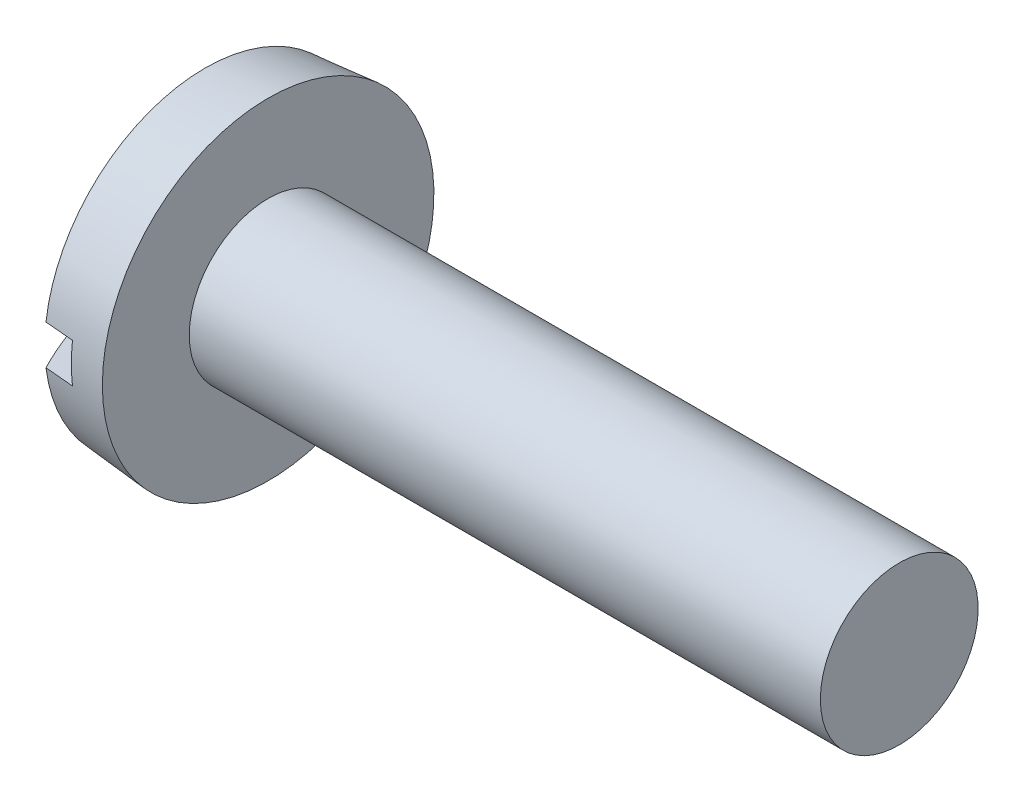
ISO-10303-21;
HEADER;
FILE_DESCRIPTION(('STEP AP214'),'2;1');
FILE_NAME('part.step','',(''),(''),'','','');
FILE_SCHEMA(('AUTOMOTIVE_DESIGN { 1 0 10303 214 1 1 1 1 }'));
ENDSEC;
DATA;
#1=APPLICATION_CONTEXT('core data for automotive mechanical design processes');
#2=APPLICATION_PROTOCOL_DEFINITION('international standard','automotive_design',2000,#1);
#3=PRODUCT_CONTEXT('',#1,'mechanical');
#4=PRODUCT('Part','Part','',(#3));
#5=PRODUCT_RELATED_PRODUCT_CATEGORY('part','',(#4));
#6=PRODUCT_DEFINITION_FORMATION('','',#4);
#7=PRODUCT_DEFINITION_CONTEXT('part definition',#1,'design');
#8=PRODUCT_DEFINITION('design','',#6,#7);
#9=PRODUCT_DEFINITION_SHAPE('','',#8);
#10=(LENGTH_UNIT() NAMED_UNIT(*) SI_UNIT(.MILLI.,.METRE.));
#11=(NAMED_UNIT(*) PLANE_ANGLE_UNIT() SI_UNIT($,.RADIAN.));
#12=(NAMED_UNIT(*) SI_UNIT($,.STERADIAN.) SOLID_ANGLE_UNIT());
#13=UNCERTAINTY_MEASURE_WITH_UNIT(LENGTH_MEASURE(1.E-05),#10,'distance_accuracy_value','');
#14=(GEOMETRIC_REPRESENTATION_CONTEXT(3) GLOBAL_UNCERTAINTY_ASSIGNED_CONTEXT((#13)) GLOBAL_UNIT_ASSIGNED_CONTEXT((#10,
#11,#12)) REPRESENTATION_CONTEXT('',''));
#15=CARTESIAN_POINT('',(0.,0.,0.));
#16=DIRECTION('',(0.,0.,1.));
#17=DIRECTION('',(1.,0.,0.));
#18=AXIS2_PLACEMENT_3D('',#15,#16,#17);
#19=CARTESIAN_POINT('',(4.1402,-1.1938,-10.0076));
#20=DIRECTION('',(1.,0.,0.));
#21=DIRECTION('',(0.,0.,-1.));
#22=AXIS2_PLACEMENT_3D('',#19,#20,#21);
#23=PLANE('',#22);
#24=DIRECTION('',(0.,0.,-1.));
#25=VECTOR('',#24,1.);
#26=CARTESIAN_POINT('',(4.1402,0.735556468531505,-10.0076));
#27=LINE('',#26,#25);
#28=CARTESIAN_POINT('',(4.1402,0.735556468531471,-0.735556468531469));
#29=VERTEX_POINT('',#28);
#30=CARTESIAN_POINT('',(4.1402,0.735556468531479,-2.91484982517482));
#31=VERTEX_POINT('',#30);
#32=EDGE_CURVE('E190',#29,#31,#27,.T.);
#33=ORIENTED_EDGE('',*,*,#32,.F.);
#34=DIRECTION('',(0.,-1.,0.));
#35=VECTOR('',#34,1.);
#36=CARTESIAN_POINT('',(4.1402,-1.1938,-0.735556468531469));
#37=LINE('',#36,#35);
#38=CARTESIAN_POINT('',(4.1402,1.1938,-0.735556468531469));
#39=VERTEX_POINT('',#38);
#40=EDGE_CURVE('E291',#39,#29,#37,.T.);
#41=ORIENTED_EDGE('',*,*,#40,.F.);
#42=DIRECTION('',(0.,0.,1.));
#43=VECTOR('',#42,1.);
#44=CARTESIAN_POINT('',(4.1402,1.1938,-10.0076));
#45=LINE('',#44,#43);
#46=CARTESIAN_POINT('',(4.1402,1.1938,-9.75482339713217));
#47=VERTEX_POINT('',#46);
#48=EDGE_CURVE('E55',#47,#39,#45,.T.);
#49=ORIENTED_EDGE('',*,*,#48,.F.);
#50=CARTESIAN_POINT('',(4.1402,0.,0.));
#51=DIRECTION('',(1.,0.,0.));
#52=DIRECTION('',(0.,0.,-1.));
#53=AXIS2_PLACEMENT_3D('',#50,#51,#52);
#54=CIRCLE('',#53,9.82760082366176);
#55=CARTESIAN_POINT('',(4.1402,-1.1938,-9.75482339713217));
#56=VERTEX_POINT('',#55);
#57=EDGE_CURVE('E244',#56,#47,#54,.T.);
#58=ORIENTED_EDGE('',*,*,#57,.F.);
#59=DIRECTION('',(0.,0.,-1.));
#60=VECTOR('',#59,1.);
#61=CARTESIAN_POINT('',(4.1402,-1.1938,10.0076));
#62=LINE('',#61,#60);
#63=CARTESIAN_POINT('',(4.1402,-1.1938,-0.735556468531469));
#64=VERTEX_POINT('',#63);
#65=EDGE_CURVE('E217',#64,#56,#62,.T.);
#66=ORIENTED_EDGE('',*,*,#65,.F.);
#67=CARTESIAN_POINT('',(4.1402,-0.735556468531466,-0.735556468531469));
#68=VERTEX_POINT('',#67);
#69=EDGE_CURVE('E290',#68,#64,#37,.T.);
#70=ORIENTED_EDGE('',*,*,#69,.F.);
#71=DIRECTION('',(0.,0.,1.));
#72=VECTOR('',#71,1.);
#73=CARTESIAN_POINT('',(4.1402,-0.735556468531434,-10.0076));
#74=LINE('',#73,#72);
#75=CARTESIAN_POINT('',(4.1402,-0.735556468531458,-2.91484982517483));
#76=VERTEX_POINT('',#75);
#77=EDGE_CURVE('E331',#76,#68,#74,.T.);
#78=ORIENTED_EDGE('',*,*,#77,.F.);
#79=DIRECTION('',(0.,1.,0.));
#80=VECTOR('',#79,1.);
#81=CARTESIAN_POINT('',(4.1402,-1.19380000000003,-2.91484982517483));
#82=LINE('',#81,#80);
#83=EDGE_CURVE('E163',#76,#31,#82,.T.);
#84=ORIENTED_EDGE('',*,*,#83,.T.);
#85=EDGE_LOOP('',(#33,#41,#49,#58,#66,#70,#78,#84));
#86=FACE_BOUND('',#85,.T.);
#87=ADVANCED_FACE('F32',(#86),#23,.F.);
#88=DIRECTION('',(0.,0.,-1.));
#89=VECTOR('',#88,1.);
#90=CARTESIAN_POINT('',(4.1402,0.735556468531505,-10.0076));
#91=LINE('',#90,#89);
#92=CARTESIAN_POINT('',(4.1402,0.735556468531458,2.91484982517482));
#93=VERTEX_POINT('',#92);
#94=CARTESIAN_POINT('',(4.1402,0.735556468531466,0.735556468531469));
#95=VERTEX_POINT('',#94);
#96=EDGE_CURVE('E151',#93,#95,#91,.T.);
#97=ORIENTED_EDGE('',*,*,#96,.F.);
#98=DIRECTION('',(0.,-1.,0.));
#99=VECTOR('',#98,1.);
#100=CARTESIAN_POINT('',(4.1402,-1.19380000000005,2.91484982517482));
#101=LINE('',#100,#99);
#102=CARTESIAN_POINT('',(4.1402,-0.735556468531479,2.91484982517482));
#103=VERTEX_POINT('',#102);
#104=EDGE_CURVE('E162',#93,#103,#101,.T.);
#105=ORIENTED_EDGE('',*,*,#104,.T.);
#106=DIRECTION('',(0.,0.,1.));
#107=VECTOR('',#106,1.);
#108=CARTESIAN_POINT('',(4.1402,-0.735556468531434,-10.0076));
#109=LINE('',#108,#107);
#110=CARTESIAN_POINT('',(4.1402,-0.735556468531471,0.735556468531469));
#111=VERTEX_POINT('',#110);
#112=EDGE_CURVE('E339',#111,#103,#109,.T.);
#113=ORIENTED_EDGE('',*,*,#112,.F.);
#114=DIRECTION('',(0.,1.,0.));
#115=VECTOR('',#114,1.);
#116=CARTESIAN_POINT('',(4.1402,-1.1938,0.735556468531469));
#117=LINE('',#116,#115);
#118=CARTESIAN_POINT('',(4.1402,-1.1938,0.735556468531469));
#119=VERTEX_POINT('',#118);
#120=EDGE_CURVE('E288',#119,#111,#117,.T.);
#121=ORIENTED_EDGE('',*,*,#120,.F.);
#122=CARTESIAN_POINT('',(4.1402,-1.1938,9.75482339713217));
#123=VERTEX_POINT('',#122);
#124=EDGE_CURVE('E218',#123,#119,#62,.T.);
#125=ORIENTED_EDGE('',*,*,#124,.F.);
#126=CARTESIAN_POINT('',(4.1402,1.1938,9.75482339713217));
#127=VERTEX_POINT('',#126);
#128=EDGE_CURVE('E248',#127,#123,#54,.T.);
#129=ORIENTED_EDGE('',*,*,#128,.F.);
#130=CARTESIAN_POINT('',(4.1402,1.1938,0.735556468531469));
#131=VERTEX_POINT('',#130);
#132=EDGE_CURVE('E221',#131,#127,#45,.T.);
#133=ORIENTED_EDGE('',*,*,#132,.F.);
#134=EDGE_CURVE('E287',#95,#131,#117,.T.);
#135=ORIENTED_EDGE('',*,*,#134,.F.);
#136=EDGE_LOOP('',(#97,#105,#113,#121,#125,#129,#133,#135));
#137=FACE_BOUND('',#136,.T.);
#138=ADVANCED_FACE('F367',(#137),#23,.F.);
#139=CARTESIAN_POINT('',(7.9338156996587,0.,-0.466952559726962));
#140=DIRECTION('',(-0.0706273813304668,0.,0.997502768420419));
#141=DIRECTION('',(0.99750276842042,0.,0.0706273813304669));
#142=AXIS2_PLACEMENT_3D('',#139,#140,#141);
#143=PLANE('',#142);
#144=ORIENTED_EDGE('',*,*,#40,.T.);
#145=DIRECTION('',(0.995024152382142,-0.0704518849151695,0.0704518849151692));
#146=VECTOR('',#145,1.);
#147=CARTESIAN_POINT('',(7.96654969377497,0.464634855598103,-0.464634855598101));
#148=LINE('',#147,#146);
#149=CARTESIAN_POINT('',(7.2644,0.514350000000002,-0.514349999999998));
#150=VERTEX_POINT('',#149);
#151=EDGE_CURVE('E192',#29,#150,#148,.T.);
#152=ORIENTED_EDGE('',*,*,#151,.T.);
#153=DIRECTION('',(0.791711995704343,-0.608317171524578,0.0560565311643809));
#154=VECTOR('',#153,1.);
#155=CARTESIAN_POINT('',(0.,6.096,-1.0287));
#156=LINE('',#155,#154);
#157=CARTESIAN_POINT('',(0.766265218274357,5.50723502896577,-0.974445207447358));
#158=VERTEX_POINT('',#157);
#159=EDGE_CURVE('E174',#158,#150,#156,.T.);
#160=ORIENTED_EDGE('',*,*,#159,.F.);
#161=CARTESIAN_POINT('',(20.7620372182505,0.,0.44133934849501));
#162=DIRECTION('',(-0.0706273813304668,0.,0.997502768420419));
#163=DIRECTION('',(0.99750276842042,0.,0.0706273813304669));
#164=AXIS2_PLACEMENT_3D('',#161,#162,#163);
#165=CIRCLE('',#164,20.788578148785);
#166=CARTESIAN_POINT('',(0.0595930389803816,1.1938,-1.02448056279947));
#167=VERTEX_POINT('',#166);
#168=EDGE_CURVE('E211',#167,#158,#165,.F.);
#169=ORIENTED_EDGE('',*,*,#168,.F.);
#170=DIRECTION('',(-0.99750276842042,0.,-0.0706273813304669));
#171=VECTOR('',#170,1.);
#172=CARTESIAN_POINT('',(3.48697518324759,1.1938,-0.781807526360966));
#173=LINE('',#172,#171);
#174=EDGE_CURVE('E205',#39,#167,#173,.T.);
#175=ORIENTED_EDGE('',*,*,#174,.F.);
#176=EDGE_LOOP('',(#144,#152,#160,#169,#175));
#177=FACE_BOUND('',#176,.T.);
#178=ADVANCED_FACE('F357',(#177),#143,.T.);
#179=DIRECTION('',(0.791711995704343,0.608317171524578,0.0560565311643811));
#180=VECTOR('',#179,1.);
#181=CARTESIAN_POINT('',(0.,-6.096,-1.0287));
#182=LINE('',#181,#180);
#183=CARTESIAN_POINT('',(0.76626521827435,-5.50723502896577,-0.974445207447359));
#184=VERTEX_POINT('',#183);
#185=CARTESIAN_POINT('',(7.2644,-0.51435,-0.51435));
#186=VERTEX_POINT('',#185);
#187=EDGE_CURVE('E175',#184,#186,#182,.T.);
#188=ORIENTED_EDGE('',*,*,#187,.T.);
#189=DIRECTION('',(-0.995024152382142,-0.0704518849151689,-0.0704518849151692));
#190=VECTOR('',#189,1.);
#191=CARTESIAN_POINT('',(7.96654969377497,-0.464634855598099,-0.464634855598101));
#192=LINE('',#191,#190);
#193=EDGE_CURVE('E336',#186,#68,#192,.T.);
#194=ORIENTED_EDGE('',*,*,#193,.T.);
#195=ORIENTED_EDGE('',*,*,#69,.T.);
#196=DIRECTION('',(0.99750276842042,0.,0.0706273813304669));
#197=VECTOR('',#196,1.);
#198=CARTESIAN_POINT('',(4.89706620664382,-1.1938,-0.68196716543868));
#199=LINE('',#198,#197);
#200=CARTESIAN_POINT('',(0.0595930389803816,-1.1938,-1.02448056279947));
#201=VERTEX_POINT('',#200);
#202=EDGE_CURVE('E208',#201,#64,#199,.T.);
#203=ORIENTED_EDGE('',*,*,#202,.F.);
#204=CARTESIAN_POINT('',(20.7620372182505,0.,0.44133934849501));
#205=DIRECTION('',(-0.0706273813304668,0.,0.997502768420419));
#206=DIRECTION('',(0.99750276842042,0.,0.0706273813304669));
#207=AXIS2_PLACEMENT_3D('',#204,#205,#206);
#208=CIRCLE('',#207,20.788578148785);
#209=EDGE_CURVE('E214',#184,#201,#208,.F.);
#210=ORIENTED_EDGE('',*,*,#209,.F.);
#211=EDGE_LOOP('',(#188,#194,#195,#203,#210));
#212=FACE_BOUND('',#211,.T.);
#213=ADVANCED_FACE('F334',(#212),#143,.T.);
#214=CARTESIAN_POINT('',(7.9338156996587,0.,0.466952559726962));
#215=DIRECTION('',(-0.0706273813304668,0.,-0.997502768420419));
#216=DIRECTION('',(-0.99750276842042,0.,0.0706273813304668));
#217=AXIS2_PLACEMENT_3D('',#214,#215,#216);
#218=PLANE('',#217);
#219=DIRECTION('',(0.791711995704343,-0.608317171524578,-0.0560565311643809));
#220=VECTOR('',#219,1.);
#221=CARTESIAN_POINT('',(0.,6.096,1.0287));
#222=LINE('',#221,#220);
#223=CARTESIAN_POINT('',(0.766265218274357,5.50723502896577,0.974445207447358));
#224=VERTEX_POINT('',#223);
#225=CARTESIAN_POINT('',(7.2644,0.514349999999998,0.514350000000002));
#226=VERTEX_POINT('',#225);
#227=EDGE_CURVE('E167',#224,#226,#222,.T.);
#228=ORIENTED_EDGE('',*,*,#227,.T.);
#229=DIRECTION('',(-0.995024152382142,0.070451884915169,0.0704518849151691));
#230=VECTOR('',#229,1.);
#231=CARTESIAN_POINT('',(7.96654969377497,0.464634855598099,0.464634855598101));
#232=LINE('',#231,#230);
#233=EDGE_CURVE('E11',#226,#95,#232,.T.);
#234=ORIENTED_EDGE('',*,*,#233,.T.);
#235=ORIENTED_EDGE('',*,*,#134,.T.);
#236=DIRECTION('',(0.99750276842042,0.,-0.0706273813304668));
#237=VECTOR('',#236,1.);
#238=CARTESIAN_POINT('',(4.89706620664382,1.1938,0.68196716543868));
#239=LINE('',#238,#237);
#240=CARTESIAN_POINT('',(0.0595930389803816,1.1938,1.02448056279947));
#241=VERTEX_POINT('',#240);
#242=EDGE_CURVE('E197',#241,#131,#239,.T.);
#243=ORIENTED_EDGE('',*,*,#242,.F.);
#244=CARTESIAN_POINT('',(20.7620372182505,0.,-0.441339348495009));
#245=DIRECTION('',(-0.0706273813304668,0.,-0.997502768420419));
#246=DIRECTION('',(-0.99750276842042,0.,0.0706273813304668));
#247=AXIS2_PLACEMENT_3D('',#244,#245,#246);
#248=CIRCLE('',#247,20.788578148785);
#249=EDGE_CURVE('E171',#224,#241,#248,.F.);
#250=ORIENTED_EDGE('',*,*,#249,.F.);
#251=EDGE_LOOP('',(#228,#234,#235,#243,#250));
#252=FACE_BOUND('',#251,.T.);
#253=ADVANCED_FACE('F169',(#252),#218,.T.);
#254=ORIENTED_EDGE('',*,*,#120,.T.);
#255=DIRECTION('',(0.995024152382142,0.0704518849151694,-0.0704518849151691));
#256=VECTOR('',#255,1.);
#257=CARTESIAN_POINT('',(7.96654969377497,-0.464634855598102,0.464634855598101));
#258=LINE('',#257,#256);
#259=CARTESIAN_POINT('',(7.2644,-0.51435,0.51435));
#260=VERTEX_POINT('',#259);
#261=EDGE_CURVE('E306',#111,#260,#258,.T.);
#262=ORIENTED_EDGE('',*,*,#261,.T.);
#263=DIRECTION('',(0.791711995704343,0.608317171524578,-0.0560565311643809));
#264=VECTOR('',#263,1.);
#265=CARTESIAN_POINT('',(0.,-6.096,1.0287));
#266=LINE('',#265,#264);
#267=CARTESIAN_POINT('',(0.76626521827435,-5.50723502896577,0.974445207447358));
#268=VERTEX_POINT('',#267);
#269=EDGE_CURVE('E301',#268,#260,#266,.T.);
#270=ORIENTED_EDGE('',*,*,#269,.F.);
#271=CARTESIAN_POINT('',(20.7620372182505,0.,-0.441339348495009));
#272=DIRECTION('',(-0.0706273813304668,0.,-0.997502768420419));
#273=DIRECTION('',(-0.99750276842042,0.,0.0706273813304668));
#274=AXIS2_PLACEMENT_3D('',#271,#272,#273);
#275=CIRCLE('',#274,20.788578148785);
#276=CARTESIAN_POINT('',(0.0595930389803816,-1.1938,1.02448056279947));
#277=VERTEX_POINT('',#276);
#278=EDGE_CURVE('E202',#277,#268,#275,.F.);
#279=ORIENTED_EDGE('',*,*,#278,.F.);
#280=DIRECTION('',(-0.99750276842042,0.,0.0706273813304668));
#281=VECTOR('',#280,1.);
#282=CARTESIAN_POINT('',(3.48697518324759,-1.1938,0.781807526360966));
#283=LINE('',#282,#281);
#284=EDGE_CURVE('E47',#119,#277,#283,.T.);
#285=ORIENTED_EDGE('',*,*,#284,.F.);
#286=EDGE_LOOP('',(#254,#262,#270,#279,#285));
#287=FACE_BOUND('',#286,.T.);
#288=ADVANCED_FACE('F305',(#287),#218,.T.);
#289=CARTESIAN_POINT('',(20.7932858958974,0.,0.));
#290=DIRECTION('',(-1.,0.,0.));
#291=DIRECTION('',(0.,1.,0.));
#292=AXIS2_PLACEMENT_3D('',#289,#290,#291);
#293=SPHERICAL_SURFACE('',#292,20.7932858958974);
#294=CARTESIAN_POINT('',(16.0196413750384,6.21279787470168,0.));
#295=DIRECTION('',(0.609275198020805,-0.79295884702594,0.));
#296=DIRECTION('',(0.79295884702594,0.609275198020805,0.));
#297=AXIS2_PLACEMENT_3D('',#294,#295,#296);
#298=CIRCLE('',#297,19.2606905095612);
#299=EDGE_CURVE('E40',#184,#268,#298,.F.);
#300=ORIENTED_EDGE('',*,*,#299,.F.);
#301=ORIENTED_EDGE('',*,*,#209,.T.);
#302=CARTESIAN_POINT('',(20.7932858958974,-1.1938,0.));
#303=DIRECTION('',(0.,1.,0.));
#304=DIRECTION('',(0.,0.,1.));
#305=AXIS2_PLACEMENT_3D('',#302,#303,#304);
#306=CIRCLE('',#305,20.758987930738);
#307=CARTESIAN_POINT('',(2.3876,-1.1938,-9.6003284636563));
#308=VERTEX_POINT('',#307);
#309=EDGE_CURVE('E227',#201,#308,#306,.F.);
#310=ORIENTED_EDGE('',*,*,#309,.T.);
#311=CARTESIAN_POINT('',(2.3876,0.,0.));
#312=DIRECTION('',(-1.,0.,0.));
#313=DIRECTION('',(0.,0.,1.));
#314=AXIS2_PLACEMENT_3D('',#311,#312,#313);
#315=CIRCLE('',#314,9.67426819196622);
#316=CARTESIAN_POINT('',(2.3876,-1.1938,9.60032846365631));
#317=VERTEX_POINT('',#316);
#318=EDGE_CURVE('E237',#308,#317,#315,.T.);
#319=ORIENTED_EDGE('',*,*,#318,.T.);
#320=EDGE_CURVE('E228',#317,#277,#306,.F.);
#321=ORIENTED_EDGE('',*,*,#320,.T.);
#322=ORIENTED_EDGE('',*,*,#278,.T.);
#323=EDGE_LOOP('',(#300,#301,#310,#319,#321,#322));
#324=FACE_BOUND('',#323,.T.);
#325=ADVANCED_FACE('F308',(#324),#293,.T.);
#326=CARTESIAN_POINT('',(20.7932858958974,1.1938,0.));
#327=DIRECTION('',(0.,-1.,0.));
#328=DIRECTION('',(0.,0.,-1.));
#329=AXIS2_PLACEMENT_3D('',#326,#327,#328);
#330=CIRCLE('',#329,20.758987930738);
#331=CARTESIAN_POINT('',(2.3876,1.1938,-9.6003284636563));
#332=VERTEX_POINT('',#331);
#333=EDGE_CURVE('E224',#332,#167,#330,.F.);
#334=ORIENTED_EDGE('',*,*,#333,.T.);
#335=ORIENTED_EDGE('',*,*,#168,.T.);
#336=CARTESIAN_POINT('',(16.0196413750384,-6.21279787470168,0.));
#337=DIRECTION('',(0.609275198020805,0.79295884702594,0.));
#338=DIRECTION('',(-0.79295884702594,0.609275198020805,0.));
#339=AXIS2_PLACEMENT_3D('',#336,#337,#338);
#340=CIRCLE('',#339,19.2606905095612);
#341=EDGE_CURVE('E294',#224,#158,#340,.F.);
#342=ORIENTED_EDGE('',*,*,#341,.F.);
#343=ORIENTED_EDGE('',*,*,#249,.T.);
#344=CARTESIAN_POINT('',(2.3876,1.1938,9.60032846365631));
#345=VERTEX_POINT('',#344);
#346=EDGE_CURVE('E223',#241,#345,#330,.F.);
#347=ORIENTED_EDGE('',*,*,#346,.T.);
#348=EDGE_CURVE('E238',#345,#332,#315,.T.);
#349=ORIENTED_EDGE('',*,*,#348,.T.);
#350=EDGE_LOOP('',(#334,#335,#342,#343,#347,#349));
#351=FACE_BOUND('',#350,.T.);
#352=ADVANCED_FACE('F371',(#351),#293,.T.);
#353=CARTESIAN_POINT('',(4.1402,-1.1938,10.0076));
#354=DIRECTION('',(0.,1.,0.));
#355=DIRECTION('',(0.,0.,1.));
#356=AXIS2_PLACEMENT_3D('',#353,#354,#355);
#357=PLANE('',#356);
#358=ORIENTED_EDGE('',*,*,#309,.F.);
#359=ORIENTED_EDGE('',*,*,#202,.T.);
#360=ORIENTED_EDGE('',*,*,#65,.T.);
#361=CARTESIAN_POINT('',(20.9117012509634,-1.1938,-11.2316513836527));
#362=CARTESIAN_POINT('',(17.938567985907,-1.1938,-10.9700682003354));
#363=CARTESIAN_POINT('',(14.9654431862068,-1.1938,-10.7083887516575));
#364=CARTESIAN_POINT('',(9.01921592215575,-1.1938,-10.184776634628));
#365=CARTESIAN_POINT('',(6.04611345780453,-1.1938,-9.92284396627949));
#366=CARTESIAN_POINT('',(0.0999361805824389,-1.1938,-9.3986647131698));
#367=CARTESIAN_POINT('',(-2.87313863228829,-1.1938,-9.1364181284069));
#368=CARTESIAN_POINT('',(-8.81925174397984,-1.1938,-8.61151093989115));
#369=CARTESIAN_POINT('',(-11.7922900428002,-1.1938,-8.34885033613322));
#370=CARTESIAN_POINT('',(-14.7653056248362,-1.1938,-8.08593267410108));
#371=B_SPLINE_CURVE_WITH_KNOTS('',3,(#361,#362,#363,#364,#365,#366,#367,#368,#369,#370),
.UNSPECIFIED.,.F.,.F.,(4,2,2,2,4),(0.,8.95385529477066,17.9077104804771,26.8615657145967,
35.815421058678),.UNSPECIFIED.);
#372=EDGE_CURVE('E255',#56,#308,#371,.T.);
#373=ORIENTED_EDGE('',*,*,#372,.T.);
#374=EDGE_LOOP('',(#358,#359,#360,#373));
#375=FACE_BOUND('',#374,.T.);
#376=ADVANCED_FACE('F273',(#375),#357,.T.);
#377=ORIENTED_EDGE('',*,*,#124,.T.);
#378=ORIENTED_EDGE('',*,*,#284,.T.);
#379=ORIENTED_EDGE('',*,*,#320,.F.);
#380=CARTESIAN_POINT('',(-14.7653056248362,-1.1938,8.08593267410108));
#381=CARTESIAN_POINT('',(-9.7725766602337,-1.1938,8.52744442815466));
#382=CARTESIAN_POINT('',(-4.77978655062093,-1.1938,8.96826372913463));
#383=CARTESIAN_POINT('',(1.16637171857507,-1.1938,9.49265901068568));
#384=CARTESIAN_POINT('',(2.11969753162393,-1.1938,9.57671508223217));
#385=CARTESIAN_POINT('',(9.01920230702145,-1.1938,10.184931448165));
#386=CARTESIAN_POINT('',(14.9654374639212,-1.1938,10.7084544533859));
#387=CARTESIAN_POINT('',(20.9117012509634,-1.1938,11.2316513836527));
#388=B_SPLINE_CURVE_WITH_KNOTS('',3,(#380,#381,#382,#383,#384,#385,#386,#387),.UNSPECIFIED.,.F.,
.F.,(4,2,2,4),(0.,15.036637627572,17.9077105555857,35.8154210198248),.UNSPECIFIED.);
#389=EDGE_CURVE('E282',#317,#123,#388,.T.);
#390=ORIENTED_EDGE('',*,*,#389,.T.);
#391=EDGE_LOOP('',(#377,#378,#379,#390));
#392=FACE_BOUND('',#391,.T.);
#393=ADVANCED_FACE('F270',(#392),#357,.T.);
#394=CARTESIAN_POINT('',(4.1402,1.1938,-10.0076));
#395=DIRECTION('',(0.,-1.,0.));
#396=DIRECTION('',(0.,0.,-1.));
#397=AXIS2_PLACEMENT_3D('',#394,#395,#396);
#398=PLANE('',#397);
#399=ORIENTED_EDGE('',*,*,#48,.T.);
#400=ORIENTED_EDGE('',*,*,#174,.T.);
#401=ORIENTED_EDGE('',*,*,#333,.F.);
#402=CARTESIAN_POINT('',(-14.7653056248362,1.1938,-8.08593267410108));
#403=CARTESIAN_POINT('',(-9.77257666023366,1.1938,-8.52744442815466));
#404=CARTESIAN_POINT('',(-4.77978655062092,1.1938,-8.96826372913463));
#405=CARTESIAN_POINT('',(1.16637171857507,1.1938,-9.49265901068568));
#406=CARTESIAN_POINT('',(2.11969753162393,1.1938,-9.57671508223217));
#407=CARTESIAN_POINT('',(9.01920230702146,1.1938,-10.184931448165));
#408=CARTESIAN_POINT('',(14.9654374639212,1.1938,-10.7084544533859));
#409=CARTESIAN_POINT('',(20.9117012509634,1.1938,-11.2316513836527));
#410=B_SPLINE_CURVE_WITH_KNOTS('',3,(#402,#403,#404,#405,#406,#407,#408,#409),.UNSPECIFIED.,.F.,
.F.,(4,2,2,4),(0.,15.036637627572,17.9077105555857,35.8154210198248),.UNSPECIFIED.);
#411=EDGE_CURVE('E247',#332,#47,#410,.T.);
#412=ORIENTED_EDGE('',*,*,#411,.T.);
#413=EDGE_LOOP('',(#399,#400,#401,#412));
#414=FACE_BOUND('',#413,.T.);
#415=ADVANCED_FACE('F265',(#414),#398,.T.);
#416=ORIENTED_EDGE('',*,*,#346,.F.);
#417=ORIENTED_EDGE('',*,*,#242,.T.);
#418=ORIENTED_EDGE('',*,*,#132,.T.);
#419=CARTESIAN_POINT('',(20.9117012509634,1.1938,11.2316513836527));
#420=CARTESIAN_POINT('',(17.938567985907,1.1938,10.9700682003354));
#421=CARTESIAN_POINT('',(14.9654431862068,1.1938,10.7083887516575));
#422=CARTESIAN_POINT('',(9.01921592215575,1.1938,10.184776634628));
#423=CARTESIAN_POINT('',(6.04611345780453,1.1938,9.92284396627949));
#424=CARTESIAN_POINT('',(0.0999361805824389,1.1938,9.3986647131698));
#425=CARTESIAN_POINT('',(-2.87313863228829,1.1938,9.1364181284069));
#426=CARTESIAN_POINT('',(-8.81925174397984,1.1938,8.61151093989115));
#427=CARTESIAN_POINT('',(-11.7922900428002,1.1938,8.34885033613322));
#428=CARTESIAN_POINT('',(-14.7653056248362,1.1938,8.08593267410108));
#429=B_SPLINE_CURVE_WITH_KNOTS('',3,(#419,#420,#421,#422,#423,#424,#425,#426,#427,#428),
.UNSPECIFIED.,.F.,.F.,(4,2,2,2,4),(0.,8.95385529477066,17.9077104804771,26.8615657145967,
35.815421058678),.UNSPECIFIED.);
#430=EDGE_CURVE('E276',#127,#345,#429,.T.);
#431=ORIENTED_EDGE('',*,*,#430,.T.);
#432=EDGE_LOOP('',(#416,#417,#418,#431));
#433=FACE_BOUND('',#432,.T.);
#434=ADVANCED_FACE('F269',(#433),#398,.T.);
#435=CARTESIAN_POINT('',(6.1976,0.,0.));
#436=DIRECTION('',(1.,0.,0.));
#437=DIRECTION('',(0.,0.,-1.));
#438=AXIS2_PLACEMENT_3D('',#435,#436,#437);
#439=CONICAL_SURFACE('',#438,10.0076,0.0872664625997194);
#440=CARTESIAN_POINT('',(6.1976,0.,0.));
#441=DIRECTION('',(-1.,0.,0.));
#442=DIRECTION('',(0.,0.,1.));
#443=AXIS2_PLACEMENT_3D('',#440,#441,#442);
#444=CIRCLE('',#443,10.0076);
#445=CARTESIAN_POINT('',(6.1976,0.,10.0076));
#446=VERTEX_POINT('',#445);
#447=EDGE_CURVE('E234',#446,#446,#444,.T.);
#448=ORIENTED_EDGE('',*,*,#447,.T.);
#449=EDGE_LOOP('',(#448));
#450=FACE_BOUND('',#449,.T.);
#451=ORIENTED_EDGE('',*,*,#389,.F.);
#452=ORIENTED_EDGE('',*,*,#318,.F.);
#453=ORIENTED_EDGE('',*,*,#372,.F.);
#454=ORIENTED_EDGE('',*,*,#57,.T.);
#455=ORIENTED_EDGE('',*,*,#411,.F.);
#456=ORIENTED_EDGE('',*,*,#348,.F.);
#457=ORIENTED_EDGE('',*,*,#430,.F.);
#458=ORIENTED_EDGE('',*,*,#128,.T.);
#459=EDGE_LOOP('',(#451,#452,#453,#454,#455,#456,#457,#458));
#460=FACE_BOUND('',#459,.T.);
#461=ADVANCED_FACE('F261',(#450,#460),#439,.T.);
#462=CARTESIAN_POINT('',(-25.4,0.,0.));
#463=DIRECTION('',(-1.,0.,0.));
#464=DIRECTION('',(0.,0.,1.));
#465=AXIS2_PLACEMENT_3D('',#462,#463,#464);
#466=CYLINDRICAL_SURFACE('',#465,4.7625);
#467=CARTESIAN_POINT('',(44.2976,0.,0.));
#468=DIRECTION('',(-1.,0.,0.));
#469=DIRECTION('',(0.,0.,1.));
#470=AXIS2_PLACEMENT_3D('',#467,#468,#469);
#471=CIRCLE('',#470,4.7625);
#472=CARTESIAN_POINT('',(44.2976,0.,4.7625));
#473=VERTEX_POINT('',#472);
#474=EDGE_CURVE('E241',#473,#473,#471,.T.);
#475=ORIENTED_EDGE('',*,*,#474,.T.);
#476=EDGE_LOOP('',(#475));
#477=FACE_BOUND('',#476,.T.);
#478=CARTESIAN_POINT('',(6.1976,0.,0.));
#479=DIRECTION('',(-1.,0.,0.));
#480=DIRECTION('',(0.,0.,1.));
#481=AXIS2_PLACEMENT_3D('',#478,#479,#480);
#482=CIRCLE('',#481,4.7625);
#483=CARTESIAN_POINT('',(6.1976,0.,4.7625));
#484=VERTEX_POINT('',#483);
#485=EDGE_CURVE('E231',#484,#484,#482,.T.);
#486=ORIENTED_EDGE('',*,*,#485,.F.);
#487=EDGE_LOOP('',(#486));
#488=FACE_BOUND('',#487,.T.);
#489=ADVANCED_FACE('F34',(#477,#488),#466,.T.);
#490=CARTESIAN_POINT('',(44.2976,4.7625,0.));
#491=DIRECTION('',(1.,0.,0.));
#492=DIRECTION('',(0.,0.,-1.));
#493=AXIS2_PLACEMENT_3D('',#490,#491,#492);
#494=PLANE('',#493);
#495=ORIENTED_EDGE('',*,*,#474,.F.);
#496=EDGE_LOOP('',(#495));
#497=FACE_BOUND('',#496,.T.);
#498=ADVANCED_FACE('F400',(#497),#494,.T.);
#499=CARTESIAN_POINT('',(6.1976,4.7625,0.));
#500=DIRECTION('',(-1.,0.,0.));
#501=DIRECTION('',(0.,0.,1.));
#502=AXIS2_PLACEMENT_3D('',#499,#500,#501);
#503=PLANE('',#502);
#504=ORIENTED_EDGE('',*,*,#447,.F.);
#505=EDGE_LOOP('',(#504));
#506=FACE_BOUND('',#505,.T.);
#507=ORIENTED_EDGE('',*,*,#485,.T.);
#508=EDGE_LOOP('',(#507));
#509=FACE_BOUND('',#508,.T.);
#510=ADVANCED_FACE('F395',(#506,#509),#503,.F.);
#511=CARTESIAN_POINT('',(7.2644,0.51435,0.51435));
#512=DIRECTION('',(-1.,0.,0.));
#513=DIRECTION('',(0.,0.,1.));
#514=AXIS2_PLACEMENT_3D('',#511,#512,#513);
#515=PLANE('',#514);
#516=DIRECTION('',(0.,1.,0.));
#517=VECTOR('',#516,1.);
#518=CARTESIAN_POINT('',(7.2644,-0.51435,0.51435));
#519=LINE('',#518,#517);
#520=EDGE_CURVE('E159',#260,#226,#519,.T.);
#521=ORIENTED_EDGE('',*,*,#520,.T.);
#522=DIRECTION('',(0.,0.,-1.));
#523=VECTOR('',#522,1.);
#524=CARTESIAN_POINT('',(7.2644,0.51435,0.51435));
#525=LINE('',#524,#523);
#526=EDGE_CURVE('E179',#226,#150,#525,.T.);
#527=ORIENTED_EDGE('',*,*,#526,.T.);
#528=DIRECTION('',(0.,-1.,0.));
#529=VECTOR('',#528,1.);
#530=CARTESIAN_POINT('',(7.2644,0.51435,-0.51435));
#531=LINE('',#530,#529);
#532=EDGE_CURVE('E184',#150,#186,#531,.T.);
#533=ORIENTED_EDGE('',*,*,#532,.T.);
#534=DIRECTION('',(0.,0.,1.));
#535=VECTOR('',#534,1.);
#536=CARTESIAN_POINT('',(7.2644,-0.51435,-0.51435));
#537=LINE('',#536,#535);
#538=EDGE_CURVE('E189',#186,#260,#537,.T.);
#539=ORIENTED_EDGE('',*,*,#538,.T.);
#540=EDGE_LOOP('',(#521,#527,#533,#539));
#541=FACE_BOUND('',#540,.T.);
#542=ADVANCED_FACE('F187',(#541),#515,.T.);
#543=CARTESIAN_POINT('',(7.2644,0.51435,0.51435));
#544=DIRECTION('',(0.609275198020805,0.79295884702594,0.));
#545=DIRECTION('',(-0.79295884702594,0.609275198020805,0.));
#546=AXIS2_PLACEMENT_3D('',#543,#544,#545);
#547=PLANE('',#546);
#548=ORIENTED_EDGE('',*,*,#341,.T.);
#549=ORIENTED_EDGE('',*,*,#159,.T.);
#550=ORIENTED_EDGE('',*,*,#526,.F.);
#551=ORIENTED_EDGE('',*,*,#227,.F.);
#552=EDGE_LOOP('',(#548,#549,#550,#551));
#553=FACE_BOUND('',#552,.T.);
#554=ADVANCED_FACE('F180',(#553),#547,.F.);
#555=CARTESIAN_POINT('',(7.2644,-0.51435,-0.51435));
#556=DIRECTION('',(0.609275198020805,-0.79295884702594,0.));
#557=DIRECTION('',(0.79295884702594,0.609275198020805,0.));
#558=AXIS2_PLACEMENT_3D('',#555,#556,#557);
#559=PLANE('',#558);
#560=ORIENTED_EDGE('',*,*,#299,.T.);
#561=ORIENTED_EDGE('',*,*,#269,.T.);
#562=ORIENTED_EDGE('',*,*,#538,.F.);
#563=ORIENTED_EDGE('',*,*,#187,.F.);
#564=EDGE_LOOP('',(#560,#561,#562,#563));
#565=FACE_BOUND('',#564,.T.);
#566=ADVANCED_FACE('F300',(#565),#559,.F.);
#567=CARTESIAN_POINT('',(7.9338156996587,-0.466952559726962,0.));
#568=DIRECTION('',(-0.0706273813304668,0.997502768420419,0.));
#569=DIRECTION('',(-0.99750276842042,-0.0706273813304668,0.));
#570=AXIS2_PLACEMENT_3D('',#567,#568,#569);
#571=PLANE('',#570);
#572=ORIENTED_EDGE('',*,*,#112,.T.);
#573=DIRECTION('',(0.791711995704343,0.0560565311643831,-0.608317171524578));
#574=VECTOR('',#573,1.);
#575=CARTESIAN_POINT('',(0.,-1.02870000000002,6.096));
#576=LINE('',#575,#574);
#577=EDGE_CURVE('E164',#103,#260,#576,.T.);
#578=ORIENTED_EDGE('',*,*,#577,.T.);
#579=ORIENTED_EDGE('',*,*,#261,.F.);
#580=EDGE_LOOP('',(#572,#578,#579));
#581=FACE_BOUND('',#580,.T.);
#582=ADVANCED_FACE('F365',(#581),#571,.T.);
#583=CARTESIAN_POINT('',(7.9338156996587,0.466952559726962,0.));
#584=DIRECTION('',(-0.0706273813304668,-0.997502768420419,0.));
#585=DIRECTION('',(0.99750276842042,-0.0706273813304669,0.));
#586=AXIS2_PLACEMENT_3D('',#583,#584,#585);
#587=PLANE('',#586);
#588=ORIENTED_EDGE('',*,*,#96,.T.);
#589=ORIENTED_EDGE('',*,*,#233,.F.);
#590=DIRECTION('',(0.791711995704343,-0.0560565311643788,-0.608317171524579));
#591=VECTOR('',#590,1.);
#592=CARTESIAN_POINT('',(0.,1.02869999999998,6.096));
#593=LINE('',#592,#591);
#594=EDGE_CURVE('E149',#93,#226,#593,.T.);
#595=ORIENTED_EDGE('',*,*,#594,.F.);
#596=EDGE_LOOP('',(#588,#589,#595));
#597=FACE_BOUND('',#596,.T.);
#598=ADVANCED_FACE('F148',(#597),#587,.T.);
#599=CARTESIAN_POINT('',(7.2644,-0.514350000000002,0.514349999999998));
#600=DIRECTION('',(0.609275198020805,0.,0.79295884702594));
#601=DIRECTION('',(-0.79295884702594,0.,0.609275198020805));
#602=AXIS2_PLACEMENT_3D('',#599,#600,#601);
#603=PLANE('',#602);
#604=ORIENTED_EDGE('',*,*,#594,.T.);
#605=ORIENTED_EDGE('',*,*,#520,.F.);
#606=ORIENTED_EDGE('',*,*,#577,.F.);
#607=ORIENTED_EDGE('',*,*,#104,.F.);
#608=EDGE_LOOP('',(#604,#605,#606,#607));
#609=FACE_BOUND('',#608,.T.);
#610=ADVANCED_FACE('F156',(#609),#603,.F.);
#611=ORIENTED_EDGE('',*,*,#32,.T.);
#612=DIRECTION('',(0.791711995704343,-0.0560565311643832,0.608317171524578));
#613=VECTOR('',#612,1.);
#614=CARTESIAN_POINT('',(0.,1.02870000000002,-6.096));
#615=LINE('',#614,#613);
#616=EDGE_CURVE('E354',#31,#150,#615,.T.);
#617=ORIENTED_EDGE('',*,*,#616,.T.);
#618=ORIENTED_EDGE('',*,*,#151,.F.);
#619=EDGE_LOOP('',(#611,#617,#618));
#620=FACE_BOUND('',#619,.T.);
#621=ADVANCED_FACE('F359',(#620),#587,.T.);
#622=ORIENTED_EDGE('',*,*,#77,.T.);
#623=ORIENTED_EDGE('',*,*,#193,.F.);
#624=DIRECTION('',(0.791711995704343,0.0560565311643788,0.608317171524579));
#625=VECTOR('',#624,1.);
#626=CARTESIAN_POINT('',(0.,-1.02869999999998,-6.096));
#627=LINE('',#626,#625);
#628=EDGE_CURVE('E355',#76,#186,#627,.T.);
#629=ORIENTED_EDGE('',*,*,#628,.F.);
#630=EDGE_LOOP('',(#622,#623,#629));
#631=FACE_BOUND('',#630,.T.);
#632=ADVANCED_FACE('F508',(#631),#571,.T.);
#633=CARTESIAN_POINT('',(7.2644,0.514350000000002,-0.514349999999998));
#634=DIRECTION('',(0.609275198020805,0.,-0.79295884702594));
#635=DIRECTION('',(0.79295884702594,0.,0.609275198020805));
#636=AXIS2_PLACEMENT_3D('',#633,#634,#635);
#637=PLANE('',#636);
#638=ORIENTED_EDGE('',*,*,#628,.T.);
#639=ORIENTED_EDGE('',*,*,#532,.F.);
#640=ORIENTED_EDGE('',*,*,#616,.F.);
#641=ORIENTED_EDGE('',*,*,#83,.F.);
#642=EDGE_LOOP('',(#638,#639,#640,#641));
#643=FACE_BOUND('',#642,.T.);
#644=ADVANCED_FACE('F353',(#643),#637,.F.);
#645=CLOSED_SHELL('',(#87,#138,#178,#213,#253,#288,#325,#352,#376,#393,#415,#434,#461,#489,#498,
#510,#542,#554,#566,#582,#598,#610,#621,#632,#644));
#646=MANIFOLD_SOLID_BREP('B2',#645);
#647=ADVANCED_BREP_SHAPE_REPRESENTATION('',(#18,#646),#14);
#648=SHAPE_DEFINITION_REPRESENTATION(#9,#647);
ENDSEC;
END-ISO-10303-21;
